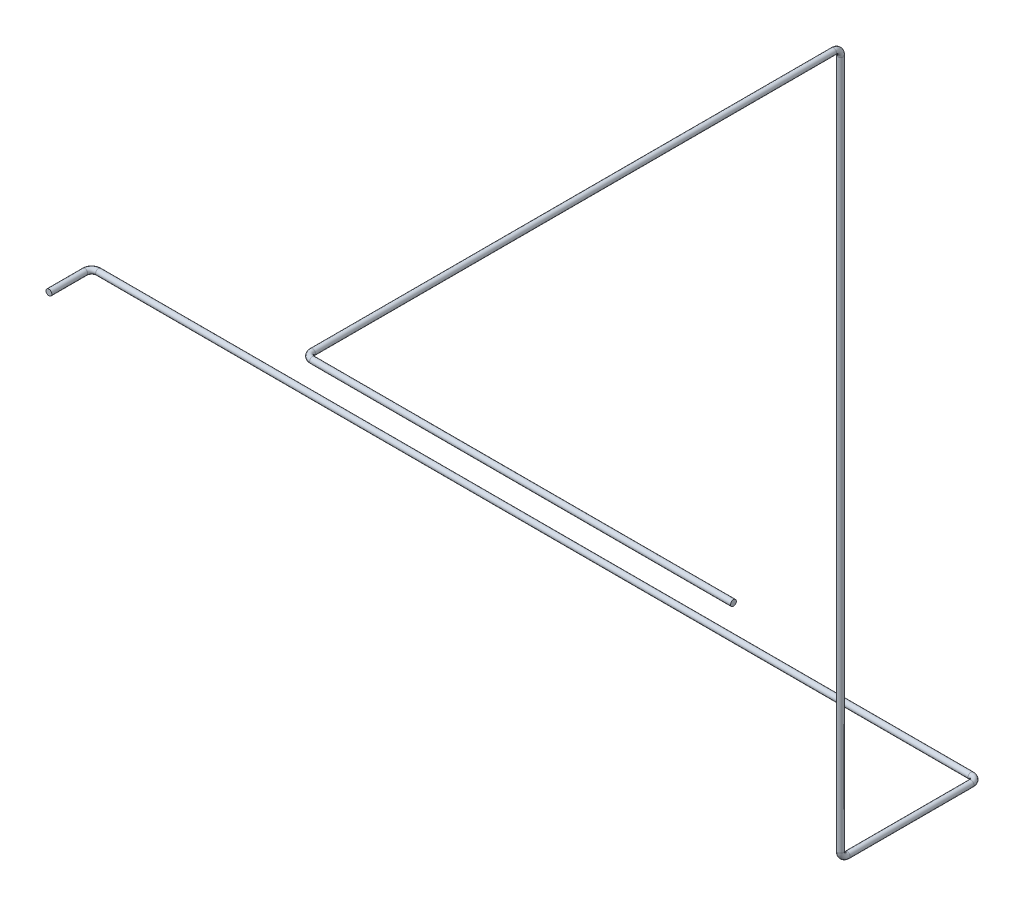
ISO-10303-21;
HEADER;
FILE_DESCRIPTION(('STEP AP214'),'2;1');
FILE_NAME('part.step','',(''),(''),'','','');
FILE_SCHEMA(('AUTOMOTIVE_DESIGN { 1 0 10303 214 1 1 1 1 }'));
ENDSEC;
DATA;
#1=APPLICATION_CONTEXT('core data for automotive mechanical design processes');
#2=APPLICATION_PROTOCOL_DEFINITION('international standard','automotive_design',2000,#1);
#3=PRODUCT_CONTEXT('',#1,'mechanical');
#4=PRODUCT('Part','Part','',(#3));
#5=PRODUCT_RELATED_PRODUCT_CATEGORY('part','',(#4));
#6=PRODUCT_DEFINITION_FORMATION('','',#4);
#7=PRODUCT_DEFINITION_CONTEXT('part definition',#1,'design');
#8=PRODUCT_DEFINITION('design','',#6,#7);
#9=PRODUCT_DEFINITION_SHAPE('','',#8);
#10=(LENGTH_UNIT() NAMED_UNIT(*) SI_UNIT(.MILLI.,.METRE.));
#11=(NAMED_UNIT(*) PLANE_ANGLE_UNIT() SI_UNIT($,.RADIAN.));
#12=(NAMED_UNIT(*) SI_UNIT($,.STERADIAN.) SOLID_ANGLE_UNIT());
#13=UNCERTAINTY_MEASURE_WITH_UNIT(LENGTH_MEASURE(1.E-05),#10,'distance_accuracy_value','');
#14=(GEOMETRIC_REPRESENTATION_CONTEXT(3) GLOBAL_UNCERTAINTY_ASSIGNED_CONTEXT((#13)) GLOBAL_UNIT_ASSIGNED_CONTEXT((#10,
#11,#12)) REPRESENTATION_CONTEXT('',''));
#15=CARTESIAN_POINT('',(0.,0.,0.));
#16=DIRECTION('',(0.,0.,1.));
#17=DIRECTION('',(1.,0.,0.));
#18=AXIS2_PLACEMENT_3D('',#15,#16,#17);
#19=CARTESIAN_POINT('',(0.,0.,200.));
#20=DIRECTION('',(0.,0.,-1.));
#21=DIRECTION('',(-1.,0.,0.));
#22=AXIS2_PLACEMENT_3D('',#19,#20,#21);
#23=CYLINDRICAL_SURFACE('',#22,19.05);
#24=CARTESIAN_POINT('',(0.,0.,200.));
#25=DIRECTION('',(0.,0.,1.));
#26=DIRECTION('',(1.,0.,0.));
#27=AXIS2_PLACEMENT_3D('',#24,#25,#26);
#28=CIRCLE('',#27,19.05);
#29=CARTESIAN_POINT('',(19.05,0.,200.));
#30=VERTEX_POINT('',#29);
#31=EDGE_CURVE('E11',#30,#30,#28,.T.);
#32=ORIENTED_EDGE('',*,*,#31,.F.);
#33=EDGE_LOOP('',(#32));
#34=FACE_BOUND('',#33,.T.);
#35=CARTESIAN_POINT('',(0.,0.,-35.));
#36=DIRECTION('',(0.,0.,-1.));
#37=DIRECTION('',(-1.,0.,0.));
#38=AXIS2_PLACEMENT_3D('',#35,#36,#37);
#39=CIRCLE('',#38,19.05);
#40=CARTESIAN_POINT('',(-19.05,0.,-35.));
#41=VERTEX_POINT('',#40);
#42=EDGE_CURVE('E75',#41,#41,#39,.T.);
#43=ORIENTED_EDGE('',*,*,#42,.F.);
#44=EDGE_LOOP('',(#43));
#45=FACE_BOUND('',#44,.T.);
#46=ADVANCED_FACE('F35',(#34,#45),#23,.T.);
#47=CARTESIAN_POINT('',(0.,0.,200.));
#48=DIRECTION('',(0.,0.,1.));
#49=DIRECTION('',(1.,0.,0.));
#50=AXIS2_PLACEMENT_3D('',#47,#48,#49);
#51=PLANE('',#50);
#52=ORIENTED_EDGE('',*,*,#31,.T.);
#53=EDGE_LOOP('',(#52));
#54=FACE_BOUND('',#53,.T.);
#55=ADVANCED_FACE('F82',(#54),#51,.T.);
#56=CARTESIAN_POINT('',(8600.,4600.,4320.));
#57=DIRECTION('',(1.,0.,0.));
#58=DIRECTION('',(0.,0.,-1.));
#59=AXIS2_PLACEMENT_3D('',#56,#57,#58);
#60=PLANE('',#59);
#61=CARTESIAN_POINT('',(8600.,4600.,4320.));
#62=DIRECTION('',(1.,0.,0.));
#63=DIRECTION('',(0.,0.,-1.));
#64=AXIS2_PLACEMENT_3D('',#61,#62,#63);
#65=CIRCLE('',#64,19.05);
#66=CARTESIAN_POINT('',(8600.,4600.,4300.95));
#67=VERTEX_POINT('',#66);
#68=EDGE_CURVE('E41',#67,#67,#65,.T.);
#69=ORIENTED_EDGE('',*,*,#68,.T.);
#70=EDGE_LOOP('',(#69));
#71=FACE_BOUND('',#70,.T.);
#72=ADVANCED_FACE('F45',(#71),#60,.T.);
#73=CARTESIAN_POINT('',(45.,0.,-35.));
#74=DIRECTION('',(0.,-1.,0.));
#75=DIRECTION('',(0.,0.,-1.));
#76=AXIS2_PLACEMENT_3D('',#73,#74,#75);
#77=TOROIDAL_SURFACE('',#76,45.,19.05);
#78=CARTESIAN_POINT('',(45.,0.,-80.));
#79=DIRECTION('',(1.,0.,0.));
#80=DIRECTION('',(0.,0.,-1.));
#81=AXIS2_PLACEMENT_3D('',#78,#79,#80);
#82=CIRCLE('',#81,19.05);
#83=CARTESIAN_POINT('',(45.,0.,-99.05));
#84=VERTEX_POINT('',#83);
#85=EDGE_CURVE('E72',#84,#84,#82,.T.);
#86=CARTESIAN_POINT('',(45.,0.,-35.));
#87=DIRECTION('',(0.,-1.,0.));
#88=DIRECTION('',(0.,0.,-1.));
#89=AXIS2_PLACEMENT_3D('',#86,#87,#88);
#90=CIRCLE('',#89,64.05);
#91=EDGE_CURVE('',#41,#84,#90,.T.);
#92=ORIENTED_EDGE('',*,*,#42,.T.);
#93=ORIENTED_EDGE('',*,*,#85,.F.);
#94=ORIENTED_EDGE('',*,*,#91,.T.);
#95=ORIENTED_EDGE('',*,*,#91,.F.);
#96=EDGE_LOOP('',(#92,#94,#93,#95));
#97=FACE_BOUND('',#96,.T.);
#98=ADVANCED_FACE('F79',(#97),#77,.T.);
#99=CARTESIAN_POINT('',(45.,0.,-80.));
#100=DIRECTION('',(1.,0.,0.));
#101=DIRECTION('',(0.,0.,-1.));
#102=AXIS2_PLACEMENT_3D('',#99,#100,#101);
#103=CYLINDRICAL_SURFACE('',#102,19.05);
#104=CARTESIAN_POINT('',(5755.,0.,-80.));
#105=DIRECTION('',(1.,0.,0.));
#106=DIRECTION('',(0.,0.,-1.));
#107=AXIS2_PLACEMENT_3D('',#104,#105,#106);
#108=CIRCLE('',#107,19.05);
#109=CARTESIAN_POINT('',(5755.,0.,-99.0499999999999));
#110=VERTEX_POINT('',#109);
#111=EDGE_CURVE('E69',#110,#110,#108,.T.);
#112=ORIENTED_EDGE('',*,*,#111,.F.);
#113=EDGE_LOOP('',(#112));
#114=FACE_BOUND('',#113,.T.);
#115=ORIENTED_EDGE('',*,*,#85,.T.);
#116=EDGE_LOOP('',(#115));
#117=FACE_BOUND('',#116,.T.);
#118=ADVANCED_FACE('F127',(#114,#117),#103,.T.);
#119=CARTESIAN_POINT('',(5755.,0.,-35.));
#120=DIRECTION('',(0.,-1.,0.));
#121=DIRECTION('',(0.,0.,-1.));
#122=AXIS2_PLACEMENT_3D('',#119,#120,#121);
#123=TOROIDAL_SURFACE('',#122,45.,19.05);
#124=CARTESIAN_POINT('',(5800.,0.,-35.));
#125=DIRECTION('',(0.,0.,1.));
#126=DIRECTION('',(1.,0.,0.));
#127=AXIS2_PLACEMENT_3D('',#124,#125,#126);
#128=CIRCLE('',#127,19.05);
#129=CARTESIAN_POINT('',(5819.05,0.,-35.));
#130=VERTEX_POINT('',#129);
#131=EDGE_CURVE('E66',#130,#130,#128,.T.);
#132=CARTESIAN_POINT('',(5755.,0.,-35.));
#133=DIRECTION('',(0.,-1.,0.));
#134=DIRECTION('',(0.,0.,-1.));
#135=AXIS2_PLACEMENT_3D('',#132,#133,#134);
#136=CIRCLE('',#135,64.05);
#137=EDGE_CURVE('',#110,#130,#136,.T.);
#138=ORIENTED_EDGE('',*,*,#111,.T.);
#139=ORIENTED_EDGE('',*,*,#131,.F.);
#140=ORIENTED_EDGE('',*,*,#137,.T.);
#141=ORIENTED_EDGE('',*,*,#137,.F.);
#142=EDGE_LOOP('',(#138,#140,#139,#141));
#143=FACE_BOUND('',#142,.T.);
#144=ADVANCED_FACE('F123',(#143),#123,.T.);
#145=CARTESIAN_POINT('',(5800.,0.,-35.));
#146=DIRECTION('',(0.,0.,1.));
#147=DIRECTION('',(1.,0.,0.));
#148=AXIS2_PLACEMENT_3D('',#145,#146,#147);
#149=CYLINDRICAL_SURFACE('',#148,19.05);
#150=CARTESIAN_POINT('',(5800.,0.,775.));
#151=DIRECTION('',(0.,0.,1.));
#152=DIRECTION('',(1.,0.,0.));
#153=AXIS2_PLACEMENT_3D('',#150,#151,#152);
#154=CIRCLE('',#153,19.05);
#155=CARTESIAN_POINT('',(5800.,-19.05,775.));
#156=VERTEX_POINT('',#155);
#157=EDGE_CURVE('E63',#156,#156,#154,.T.);
#158=ORIENTED_EDGE('',*,*,#157,.F.);
#159=EDGE_LOOP('',(#158));
#160=FACE_BOUND('',#159,.T.);
#161=ORIENTED_EDGE('',*,*,#131,.T.);
#162=EDGE_LOOP('',(#161));
#163=FACE_BOUND('',#162,.T.);
#164=ADVANCED_FACE('F119',(#160,#163),#149,.T.);
#165=CARTESIAN_POINT('',(5800.,45.,775.));
#166=DIRECTION('',(-1.,0.,0.));
#167=DIRECTION('',(0.,0.,1.));
#168=AXIS2_PLACEMENT_3D('',#165,#166,#167);
#169=TOROIDAL_SURFACE('',#168,45.,19.05);
#170=CARTESIAN_POINT('',(5800.,45.,820.));
#171=DIRECTION('',(0.,1.,0.));
#172=DIRECTION('',(1.,0.,0.));
#173=AXIS2_PLACEMENT_3D('',#170,#171,#172);
#174=CIRCLE('',#173,19.05);
#175=CARTESIAN_POINT('',(5800.,45.,839.05));
#176=VERTEX_POINT('',#175);
#177=EDGE_CURVE('E60',#176,#176,#174,.T.);
#178=CARTESIAN_POINT('',(5800.,45.,775.));
#179=DIRECTION('',(-1.,0.,0.));
#180=DIRECTION('',(0.,0.,1.));
#181=AXIS2_PLACEMENT_3D('',#178,#179,#180);
#182=CIRCLE('',#181,64.05);
#183=EDGE_CURVE('',#156,#176,#182,.T.);
#184=ORIENTED_EDGE('',*,*,#157,.T.);
#185=ORIENTED_EDGE('',*,*,#177,.F.);
#186=ORIENTED_EDGE('',*,*,#183,.T.);
#187=ORIENTED_EDGE('',*,*,#183,.F.);
#188=EDGE_LOOP('',(#184,#186,#185,#187));
#189=FACE_BOUND('',#188,.T.);
#190=ADVANCED_FACE('F115',(#189),#169,.T.);
#191=CARTESIAN_POINT('',(5800.,45.,820.));
#192=DIRECTION('',(0.,1.,0.));
#193=DIRECTION('',(0.,0.,1.));
#194=AXIS2_PLACEMENT_3D('',#191,#192,#193);
#195=CYLINDRICAL_SURFACE('',#194,19.05);
#196=CARTESIAN_POINT('',(5800.,4555.,820.));
#197=DIRECTION('',(0.,1.,0.));
#198=DIRECTION('',(1.,0.,0.));
#199=AXIS2_PLACEMENT_3D('',#196,#197,#198);
#200=CIRCLE('',#199,19.05);
#201=CARTESIAN_POINT('',(5800.,4555.,800.95));
#202=VERTEX_POINT('',#201);
#203=EDGE_CURVE('E57',#202,#202,#200,.T.);
#204=ORIENTED_EDGE('',*,*,#203,.F.);
#205=EDGE_LOOP('',(#204));
#206=FACE_BOUND('',#205,.T.);
#207=ORIENTED_EDGE('',*,*,#177,.T.);
#208=EDGE_LOOP('',(#207));
#209=FACE_BOUND('',#208,.T.);
#210=ADVANCED_FACE('F111',(#206,#209),#195,.T.);
#211=CARTESIAN_POINT('',(5800.,4555.,865.));
#212=DIRECTION('',(1.,0.,0.));
#213=DIRECTION('',(0.,0.,-1.));
#214=AXIS2_PLACEMENT_3D('',#211,#212,#213);
#215=TOROIDAL_SURFACE('',#214,45.,19.05);
#216=CARTESIAN_POINT('',(5800.,4600.,865.));
#217=DIRECTION('',(0.,0.,1.));
#218=DIRECTION('',(1.,0.,0.));
#219=AXIS2_PLACEMENT_3D('',#216,#217,#218);
#220=CIRCLE('',#219,19.05);
#221=CARTESIAN_POINT('',(5800.,4619.05,865.));
#222=VERTEX_POINT('',#221);
#223=EDGE_CURVE('E54',#222,#222,#220,.T.);
#224=CARTESIAN_POINT('',(5800.,4555.,865.));
#225=DIRECTION('',(1.,0.,0.));
#226=DIRECTION('',(0.,0.,-1.));
#227=AXIS2_PLACEMENT_3D('',#224,#225,#226);
#228=CIRCLE('',#227,64.05);
#229=EDGE_CURVE('',#202,#222,#228,.T.);
#230=ORIENTED_EDGE('',*,*,#203,.T.);
#231=ORIENTED_EDGE('',*,*,#223,.F.);
#232=ORIENTED_EDGE('',*,*,#229,.T.);
#233=ORIENTED_EDGE('',*,*,#229,.F.);
#234=EDGE_LOOP('',(#230,#232,#231,#233));
#235=FACE_BOUND('',#234,.T.);
#236=ADVANCED_FACE('F107',(#235),#215,.T.);
#237=CARTESIAN_POINT('',(5800.,4600.,865.));
#238=DIRECTION('',(0.,0.,1.));
#239=DIRECTION('',(1.,0.,0.));
#240=AXIS2_PLACEMENT_3D('',#237,#238,#239);
#241=CYLINDRICAL_SURFACE('',#240,19.05);
#242=CARTESIAN_POINT('',(5800.,4600.,4275.));
#243=DIRECTION('',(0.,0.,1.));
#244=DIRECTION('',(1.,0.,0.));
#245=AXIS2_PLACEMENT_3D('',#242,#243,#244);
#246=CIRCLE('',#245,19.05);
#247=CARTESIAN_POINT('',(5780.95,4600.,4275.));
#248=VERTEX_POINT('',#247);
#249=EDGE_CURVE('E49',#248,#248,#246,.T.);
#250=ORIENTED_EDGE('',*,*,#249,.F.);
#251=EDGE_LOOP('',(#250));
#252=FACE_BOUND('',#251,.T.);
#253=ORIENTED_EDGE('',*,*,#223,.T.);
#254=EDGE_LOOP('',(#253));
#255=FACE_BOUND('',#254,.T.);
#256=ADVANCED_FACE('F100',(#252,#255),#241,.T.);
#257=CARTESIAN_POINT('',(5845.,4600.,4275.));
#258=DIRECTION('',(0.,1.,0.));
#259=DIRECTION('',(0.,0.,1.));
#260=AXIS2_PLACEMENT_3D('',#257,#258,#259);
#261=TOROIDAL_SURFACE('',#260,44.9999999999999,19.05);
#262=CARTESIAN_POINT('',(5845.,4600.,4320.));
#263=DIRECTION('',(1.,0.,0.));
#264=DIRECTION('',(0.,0.,-1.));
#265=AXIS2_PLACEMENT_3D('',#262,#263,#264);
#266=CIRCLE('',#265,19.05);
#267=CARTESIAN_POINT('',(5845.,4600.,4339.05));
#268=VERTEX_POINT('',#267);
#269=EDGE_CURVE('E47',#268,#268,#266,.T.);
#270=CARTESIAN_POINT('',(5845.,4600.,4275.));
#271=DIRECTION('',(0.,1.,0.));
#272=DIRECTION('',(0.,0.,1.));
#273=AXIS2_PLACEMENT_3D('',#270,#271,#272);
#274=CIRCLE('',#273,64.0499999999999);
#275=EDGE_CURVE('',#248,#268,#274,.T.);
#276=ORIENTED_EDGE('',*,*,#249,.T.);
#277=ORIENTED_EDGE('',*,*,#269,.F.);
#278=ORIENTED_EDGE('',*,*,#275,.T.);
#279=ORIENTED_EDGE('',*,*,#275,.F.);
#280=EDGE_LOOP('',(#276,#278,#277,#279));
#281=FACE_BOUND('',#280,.T.);
#282=ADVANCED_FACE('F95',(#281),#261,.T.);
#283=CARTESIAN_POINT('',(5845.,4600.,4320.));
#284=DIRECTION('',(1.,0.,0.));
#285=DIRECTION('',(0.,0.,-1.));
#286=AXIS2_PLACEMENT_3D('',#283,#284,#285);
#287=CYLINDRICAL_SURFACE('',#286,19.05);
#288=ORIENTED_EDGE('',*,*,#68,.F.);
#289=EDGE_LOOP('',(#288));
#290=FACE_BOUND('',#289,.T.);
#291=ORIENTED_EDGE('',*,*,#269,.T.);
#292=EDGE_LOOP('',(#291));
#293=FACE_BOUND('',#292,.T.);
#294=ADVANCED_FACE('F88',(#290,#293),#287,.T.);
#295=CLOSED_SHELL('',(#46,#55,#72,#98,#118,#144,#164,#190,#210,#236,#256,#282,#294));
#296=MANIFOLD_SOLID_BREP('B2',#295);
#297=ADVANCED_BREP_SHAPE_REPRESENTATION('',(#18,#296),#14);
#298=SHAPE_DEFINITION_REPRESENTATION(#9,#297);
ENDSEC;
END-ISO-10303-21;
